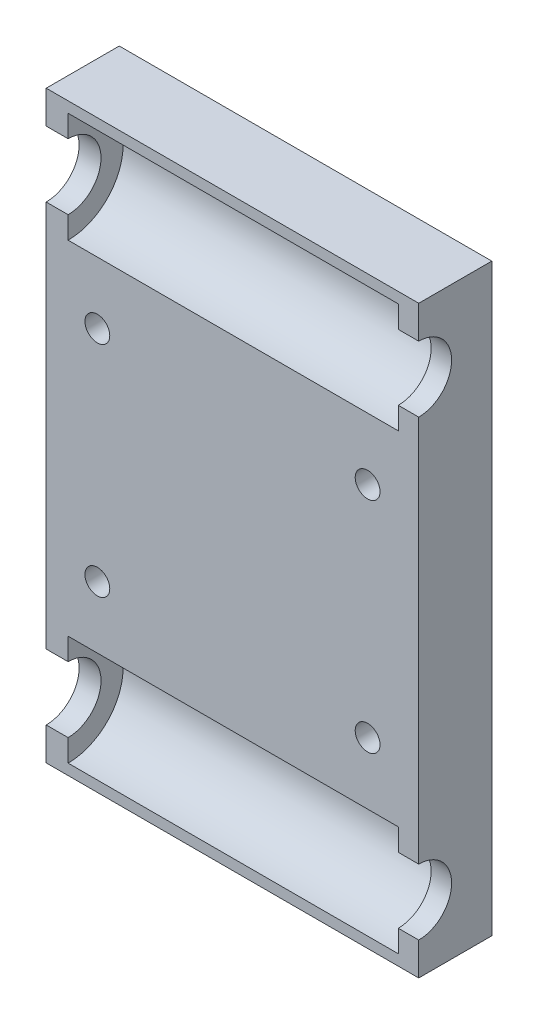
ISO-10303-21;
HEADER;
FILE_DESCRIPTION(('STEP AP214'),'2;1');
FILE_NAME('part.step','',(''),(''),'','','');
FILE_SCHEMA(('AUTOMOTIVE_DESIGN { 1 0 10303 214 1 1 1 1 }'));
ENDSEC;
DATA;
#1=APPLICATION_CONTEXT('core data for automotive mechanical design processes');
#2=APPLICATION_PROTOCOL_DEFINITION('international standard','automotive_design',2000,#1);
#3=PRODUCT_CONTEXT('',#1,'mechanical');
#4=PRODUCT('Part','Part','',(#3));
#5=PRODUCT_RELATED_PRODUCT_CATEGORY('part','',(#4));
#6=PRODUCT_DEFINITION_FORMATION('','',#4);
#7=PRODUCT_DEFINITION_CONTEXT('part definition',#1,'design');
#8=PRODUCT_DEFINITION('design','',#6,#7);
#9=PRODUCT_DEFINITION_SHAPE('','',#8);
#10=(LENGTH_UNIT() NAMED_UNIT(*) SI_UNIT(.MILLI.,.METRE.));
#11=(NAMED_UNIT(*) PLANE_ANGLE_UNIT() SI_UNIT($,.RADIAN.));
#12=(NAMED_UNIT(*) SI_UNIT($,.STERADIAN.) SOLID_ANGLE_UNIT());
#13=UNCERTAINTY_MEASURE_WITH_UNIT(LENGTH_MEASURE(1.E-05),#10,'distance_accuracy_value','');
#14=(GEOMETRIC_REPRESENTATION_CONTEXT(3) GLOBAL_UNCERTAINTY_ASSIGNED_CONTEXT((#13)) GLOBAL_UNIT_ASSIGNED_CONTEXT((#10,
#11,#12)) REPRESENTATION_CONTEXT('',''));
#15=CARTESIAN_POINT('',(0.,0.,0.));
#16=DIRECTION('',(0.,0.,1.));
#17=DIRECTION('',(1.,0.,0.));
#18=AXIS2_PLACEMENT_3D('',#15,#16,#17);
#19=CARTESIAN_POINT('',(7.,55.,10.));
#20=DIRECTION('',(0.,0.,-1.));
#21=DIRECTION('',(-1.,0.,0.));
#22=AXIS2_PLACEMENT_3D('',#19,#20,#21);
#23=CYLINDRICAL_SURFACE('',#22,1.7);
#24=CARTESIAN_POINT('',(7.,55.,10.));
#25=DIRECTION('',(0.,0.,1.));
#26=DIRECTION('',(1.,0.,0.));
#27=AXIS2_PLACEMENT_3D('',#24,#25,#26);
#28=CIRCLE('',#27,1.7);
#29=CARTESIAN_POINT('',(8.7,55.,10.));
#30=VERTEX_POINT('',#29);
#31=EDGE_CURVE('E197',#30,#30,#28,.T.);
#32=ORIENTED_EDGE('',*,*,#31,.T.);
#33=EDGE_LOOP('',(#32));
#34=FACE_BOUND('',#33,.T.);
#35=CARTESIAN_POINT('',(7.,55.,3.));
#36=DIRECTION('',(0.,0.,-1.));
#37=DIRECTION('',(-1.,0.,0.));
#38=AXIS2_PLACEMENT_3D('',#35,#36,#37);
#39=CIRCLE('',#38,1.7);
#40=CARTESIAN_POINT('',(5.3,55.,3.));
#41=VERTEX_POINT('',#40);
#42=EDGE_CURVE('E39',#41,#41,#39,.T.);
#43=ORIENTED_EDGE('',*,*,#42,.T.);
#44=EDGE_LOOP('',(#43));
#45=FACE_BOUND('',#44,.T.);
#46=ADVANCED_FACE('F35',(#34,#45),#23,.F.);
#47=CARTESIAN_POINT('',(44.,55.,10.));
#48=DIRECTION('',(0.,0.,-1.));
#49=DIRECTION('',(-1.,0.,0.));
#50=AXIS2_PLACEMENT_3D('',#47,#48,#49);
#51=CYLINDRICAL_SURFACE('',#50,1.7);
#52=CARTESIAN_POINT('',(44.,55.,10.));
#53=DIRECTION('',(0.,0.,1.));
#54=DIRECTION('',(1.,0.,0.));
#55=AXIS2_PLACEMENT_3D('',#52,#53,#54);
#56=CIRCLE('',#55,1.7);
#57=CARTESIAN_POINT('',(45.7,55.,10.));
#58=VERTEX_POINT('',#57);
#59=EDGE_CURVE('E290',#58,#58,#56,.T.);
#60=ORIENTED_EDGE('',*,*,#59,.T.);
#61=EDGE_LOOP('',(#60));
#62=FACE_BOUND('',#61,.T.);
#63=CARTESIAN_POINT('',(44.,55.,3.));
#64=DIRECTION('',(0.,0.,-1.));
#65=DIRECTION('',(-1.,0.,0.));
#66=AXIS2_PLACEMENT_3D('',#63,#64,#65);
#67=CIRCLE('',#66,1.7);
#68=CARTESIAN_POINT('',(42.3,55.,3.));
#69=VERTEX_POINT('',#68);
#70=EDGE_CURVE('E245',#69,#69,#67,.T.);
#71=ORIENTED_EDGE('',*,*,#70,.T.);
#72=EDGE_LOOP('',(#71));
#73=FACE_BOUND('',#72,.T.);
#74=ADVANCED_FACE('F393',(#62,#73),#51,.F.);
#75=CARTESIAN_POINT('',(7.,25.,10.));
#76=DIRECTION('',(0.,0.,-1.));
#77=DIRECTION('',(-1.,0.,0.));
#78=AXIS2_PLACEMENT_3D('',#75,#76,#77);
#79=CYLINDRICAL_SURFACE('',#78,1.7);
#80=CARTESIAN_POINT('',(7.,25.,10.));
#81=DIRECTION('',(0.,0.,1.));
#82=DIRECTION('',(1.,0.,0.));
#83=AXIS2_PLACEMENT_3D('',#80,#81,#82);
#84=CIRCLE('',#83,1.7);
#85=CARTESIAN_POINT('',(8.7,25.,10.));
#86=VERTEX_POINT('',#85);
#87=EDGE_CURVE('E287',#86,#86,#84,.T.);
#88=ORIENTED_EDGE('',*,*,#87,.T.);
#89=EDGE_LOOP('',(#88));
#90=FACE_BOUND('',#89,.T.);
#91=CARTESIAN_POINT('',(7.,25.,3.));
#92=DIRECTION('',(0.,0.,-1.));
#93=DIRECTION('',(-1.,0.,0.));
#94=AXIS2_PLACEMENT_3D('',#91,#92,#93);
#95=CIRCLE('',#94,1.7);
#96=CARTESIAN_POINT('',(5.3,25.,3.));
#97=VERTEX_POINT('',#96);
#98=EDGE_CURVE('E242',#97,#97,#95,.T.);
#99=ORIENTED_EDGE('',*,*,#98,.T.);
#100=EDGE_LOOP('',(#99));
#101=FACE_BOUND('',#100,.T.);
#102=ADVANCED_FACE('F399',(#90,#101),#79,.F.);
#103=CARTESIAN_POINT('',(44.,25.,10.));
#104=DIRECTION('',(0.,0.,-1.));
#105=DIRECTION('',(-1.,0.,0.));
#106=AXIS2_PLACEMENT_3D('',#103,#104,#105);
#107=CYLINDRICAL_SURFACE('',#106,1.7);
#108=CARTESIAN_POINT('',(44.,25.,10.));
#109=DIRECTION('',(0.,0.,1.));
#110=DIRECTION('',(1.,0.,0.));
#111=AXIS2_PLACEMENT_3D('',#108,#109,#110);
#112=CIRCLE('',#111,1.7);
#113=CARTESIAN_POINT('',(45.7,25.,10.));
#114=VERTEX_POINT('',#113);
#115=EDGE_CURVE('E275',#114,#114,#112,.T.);
#116=ORIENTED_EDGE('',*,*,#115,.T.);
#117=EDGE_LOOP('',(#116));
#118=FACE_BOUND('',#117,.T.);
#119=CARTESIAN_POINT('',(44.,25.,3.));
#120=DIRECTION('',(0.,0.,-1.));
#121=DIRECTION('',(-1.,0.,0.));
#122=AXIS2_PLACEMENT_3D('',#119,#120,#121);
#123=CIRCLE('',#122,1.7);
#124=CARTESIAN_POINT('',(42.3,25.,3.));
#125=VERTEX_POINT('',#124);
#126=EDGE_CURVE('E239',#125,#125,#123,.T.);
#127=ORIENTED_EDGE('',*,*,#126,.T.);
#128=EDGE_LOOP('',(#127));
#129=FACE_BOUND('',#128,.T.);
#130=ADVANCED_FACE('F439',(#118,#129),#107,.F.);
#131=CARTESIAN_POINT('',(0.,0.,10.));
#132=DIRECTION('',(0.,0.,-1.));
#133=DIRECTION('',(-1.,0.,0.));
#134=AXIS2_PLACEMENT_3D('',#131,#132,#133);
#135=PLANE('',#134);
#136=ORIENTED_EDGE('',*,*,#115,.F.);
#137=EDGE_LOOP('',(#136));
#138=FACE_BOUND('',#137,.T.);
#139=ORIENTED_EDGE('',*,*,#87,.F.);
#140=EDGE_LOOP('',(#139));
#141=FACE_BOUND('',#140,.T.);
#142=ORIENTED_EDGE('',*,*,#59,.F.);
#143=EDGE_LOOP('',(#142));
#144=FACE_BOUND('',#143,.T.);
#145=ORIENTED_EDGE('',*,*,#31,.F.);
#146=EDGE_LOOP('',(#145));
#147=FACE_BOUND('',#146,.T.);
#148=DIRECTION('',(0.,1.,0.));
#149=VECTOR('',#148,1.);
#150=CARTESIAN_POINT('',(51.,0.,10.));
#151=LINE('',#150,#149);
#152=CARTESIAN_POINT('',(51.,13.5,10.));
#153=VERTEX_POINT('',#152);
#154=CARTESIAN_POINT('',(51.,66.5,10.));
#155=VERTEX_POINT('',#154);
#156=EDGE_CURVE('E176',#153,#155,#151,.T.);
#157=ORIENTED_EDGE('',*,*,#156,.T.);
#158=DIRECTION('',(-1.,0.,0.));
#159=VECTOR('',#158,1.);
#160=CARTESIAN_POINT('',(51.,66.5,10.));
#161=LINE('',#160,#159);
#162=CARTESIAN_POINT('',(48.2,66.5,10.));
#163=VERTEX_POINT('',#162);
#164=EDGE_CURVE('E154',#155,#163,#161,.T.);
#165=ORIENTED_EDGE('',*,*,#164,.T.);
#166=DIRECTION('',(0.,1.,0.));
#167=VECTOR('',#166,1.);
#168=CARTESIAN_POINT('',(48.2,0.,10.));
#169=LINE('',#168,#167);
#170=CARTESIAN_POINT('',(48.2,63.475,10.));
#171=VERTEX_POINT('',#170);
#172=EDGE_CURVE('E234',#171,#163,#169,.T.);
#173=ORIENTED_EDGE('',*,*,#172,.F.);
#174=DIRECTION('',(-1.,0.,0.));
#175=VECTOR('',#174,1.);
#176=CARTESIAN_POINT('',(48.2,63.475,10.));
#177=LINE('',#176,#175);
#178=CARTESIAN_POINT('',(3.,63.475,10.));
#179=VERTEX_POINT('',#178);
#180=EDGE_CURVE('E231',#171,#179,#177,.T.);
#181=ORIENTED_EDGE('',*,*,#180,.T.);
#182=DIRECTION('',(0.,1.,0.));
#183=VECTOR('',#182,1.);
#184=CARTESIAN_POINT('',(3.,0.,10.));
#185=LINE('',#184,#183);
#186=CARTESIAN_POINT('',(3.,66.5,10.));
#187=VERTEX_POINT('',#186);
#188=EDGE_CURVE('E226',#179,#187,#185,.T.);
#189=ORIENTED_EDGE('',*,*,#188,.T.);
#190=CARTESIAN_POINT('',(0.,66.5,10.));
#191=VERTEX_POINT('',#190);
#192=EDGE_CURVE('E261',#187,#191,#161,.T.);
#193=ORIENTED_EDGE('',*,*,#192,.T.);
#194=DIRECTION('',(0.,-1.,0.));
#195=VECTOR('',#194,1.);
#196=CARTESIAN_POINT('',(0.,0.,10.));
#197=LINE('',#196,#195);
#198=CARTESIAN_POINT('',(0.,13.5,10.));
#199=VERTEX_POINT('',#198);
#200=EDGE_CURVE('E295',#191,#199,#197,.T.);
#201=ORIENTED_EDGE('',*,*,#200,.T.);
#202=DIRECTION('',(-1.,0.,0.));
#203=VECTOR('',#202,1.);
#204=CARTESIAN_POINT('',(51.,13.5,10.));
#205=LINE('',#204,#203);
#206=CARTESIAN_POINT('',(3.,13.5,10.));
#207=VERTEX_POINT('',#206);
#208=EDGE_CURVE('E265',#199,#207,#205,.F.);
#209=ORIENTED_EDGE('',*,*,#208,.T.);
#210=DIRECTION('',(0.,1.,0.));
#211=VECTOR('',#210,1.);
#212=CARTESIAN_POINT('',(3.,0.,10.));
#213=LINE('',#212,#211);
#214=CARTESIAN_POINT('',(3.,16.525,10.));
#215=VERTEX_POINT('',#214);
#216=EDGE_CURVE('E211',#207,#215,#213,.T.);
#217=ORIENTED_EDGE('',*,*,#216,.T.);
#218=DIRECTION('',(-1.,0.,0.));
#219=VECTOR('',#218,1.);
#220=CARTESIAN_POINT('',(48.2,16.525,10.));
#221=LINE('',#220,#219);
#222=CARTESIAN_POINT('',(48.2,16.525,10.));
#223=VERTEX_POINT('',#222);
#224=EDGE_CURVE('E215',#215,#223,#221,.F.);
#225=ORIENTED_EDGE('',*,*,#224,.T.);
#226=DIRECTION('',(0.,1.,0.));
#227=VECTOR('',#226,1.);
#228=CARTESIAN_POINT('',(48.2,0.,10.));
#229=LINE('',#228,#227);
#230=CARTESIAN_POINT('',(48.2,13.5,10.));
#231=VERTEX_POINT('',#230);
#232=EDGE_CURVE('E221',#231,#223,#229,.T.);
#233=ORIENTED_EDGE('',*,*,#232,.F.);
#234=EDGE_CURVE('E52',#231,#153,#205,.F.);
#235=ORIENTED_EDGE('',*,*,#234,.T.);
#236=EDGE_LOOP('',(#157,#165,#173,#181,#189,#193,#201,#209,#217,#225,#233,#235));
#237=FACE_BOUND('',#236,.T.);
#238=ADVANCED_FACE('F315',(#138,#141,#144,#147,#237),#135,.F.);
#239=CARTESIAN_POINT('',(51.,0.,10.));
#240=VERTEX_POINT('',#239);
#241=CARTESIAN_POINT('',(51.,4.49999999999999,10.));
#242=VERTEX_POINT('',#241);
#243=EDGE_CURVE('E179',#240,#242,#151,.T.);
#244=ORIENTED_EDGE('',*,*,#243,.T.);
#245=DIRECTION('',(-1.,0.,0.));
#246=VECTOR('',#245,1.);
#247=CARTESIAN_POINT('',(51.,4.49999999999999,10.));
#248=LINE('',#247,#246);
#249=CARTESIAN_POINT('',(48.2,4.49999999999999,10.));
#250=VERTEX_POINT('',#249);
#251=EDGE_CURVE('E270',#242,#250,#248,.T.);
#252=ORIENTED_EDGE('',*,*,#251,.T.);
#253=CARTESIAN_POINT('',(48.2,1.47499999999999,10.));
#254=VERTEX_POINT('',#253);
#255=EDGE_CURVE('E222',#254,#250,#229,.T.);
#256=ORIENTED_EDGE('',*,*,#255,.F.);
#257=DIRECTION('',(-1.,0.,0.));
#258=VECTOR('',#257,1.);
#259=CARTESIAN_POINT('',(48.2,1.47499999999999,10.));
#260=LINE('',#259,#258);
#261=CARTESIAN_POINT('',(3.,1.47499999999999,10.));
#262=VERTEX_POINT('',#261);
#263=EDGE_CURVE('E218',#254,#262,#260,.T.);
#264=ORIENTED_EDGE('',*,*,#263,.T.);
#265=CARTESIAN_POINT('',(3.,4.49999999999999,10.));
#266=VERTEX_POINT('',#265);
#267=EDGE_CURVE('E212',#262,#266,#213,.T.);
#268=ORIENTED_EDGE('',*,*,#267,.T.);
#269=CARTESIAN_POINT('',(0.,4.49999999999999,10.));
#270=VERTEX_POINT('',#269);
#271=EDGE_CURVE('E60',#266,#270,#248,.T.);
#272=ORIENTED_EDGE('',*,*,#271,.T.);
#273=CARTESIAN_POINT('',(0.,0.,10.));
#274=VERTEX_POINT('',#273);
#275=EDGE_CURVE('E202',#270,#274,#197,.T.);
#276=ORIENTED_EDGE('',*,*,#275,.T.);
#277=DIRECTION('',(1.,0.,0.));
#278=VECTOR('',#277,1.);
#279=CARTESIAN_POINT('',(0.,0.,10.));
#280=LINE('',#279,#278);
#281=EDGE_CURVE('E177',#274,#240,#280,.T.);
#282=ORIENTED_EDGE('',*,*,#281,.T.);
#283=EDGE_LOOP('',(#244,#252,#256,#264,#268,#272,#276,#282));
#284=FACE_BOUND('',#283,.T.);
#285=ADVANCED_FACE('F300',(#284),#135,.F.);
#286=CARTESIAN_POINT('',(0.,80.,10.));
#287=VERTEX_POINT('',#286);
#288=CARTESIAN_POINT('',(0.,75.5,10.));
#289=VERTEX_POINT('',#288);
#290=EDGE_CURVE('E180',#287,#289,#197,.T.);
#291=ORIENTED_EDGE('',*,*,#290,.T.);
#292=DIRECTION('',(-1.,0.,0.));
#293=VECTOR('',#292,1.);
#294=CARTESIAN_POINT('',(51.,75.5,10.));
#295=LINE('',#294,#293);
#296=CARTESIAN_POINT('',(3.,75.5,10.));
#297=VERTEX_POINT('',#296);
#298=EDGE_CURVE('E159',#289,#297,#295,.F.);
#299=ORIENTED_EDGE('',*,*,#298,.T.);
#300=CARTESIAN_POINT('',(3.,78.525,10.));
#301=VERTEX_POINT('',#300);
#302=EDGE_CURVE('E225',#297,#301,#185,.T.);
#303=ORIENTED_EDGE('',*,*,#302,.T.);
#304=DIRECTION('',(-1.,0.,0.));
#305=VECTOR('',#304,1.);
#306=CARTESIAN_POINT('',(48.2,78.525,10.));
#307=LINE('',#306,#305);
#308=CARTESIAN_POINT('',(48.2,78.525,10.));
#309=VERTEX_POINT('',#308);
#310=EDGE_CURVE('E229',#301,#309,#307,.F.);
#311=ORIENTED_EDGE('',*,*,#310,.T.);
#312=CARTESIAN_POINT('',(48.2,75.5,10.));
#313=VERTEX_POINT('',#312);
#314=EDGE_CURVE('E169',#313,#309,#169,.T.);
#315=ORIENTED_EDGE('',*,*,#314,.F.);
#316=CARTESIAN_POINT('',(51.,75.5,10.));
#317=VERTEX_POINT('',#316);
#318=EDGE_CURVE('E151',#313,#317,#295,.F.);
#319=ORIENTED_EDGE('',*,*,#318,.T.);
#320=CARTESIAN_POINT('',(51.,80.,10.));
#321=VERTEX_POINT('',#320);
#322=EDGE_CURVE('E166',#317,#321,#151,.T.);
#323=ORIENTED_EDGE('',*,*,#322,.T.);
#324=DIRECTION('',(-1.,0.,0.));
#325=VECTOR('',#324,1.);
#326=CARTESIAN_POINT('',(0.,80.,10.));
#327=LINE('',#326,#325);
#328=EDGE_CURVE('E184',#321,#287,#327,.T.);
#329=ORIENTED_EDGE('',*,*,#328,.T.);
#330=EDGE_LOOP('',(#291,#299,#303,#311,#315,#319,#323,#329));
#331=FACE_BOUND('',#330,.T.);
#332=ADVANCED_FACE('F165',(#331),#135,.F.);
#333=CARTESIAN_POINT('',(0.,0.,0.));
#334=DIRECTION('',(0.,0.,-1.));
#335=DIRECTION('',(-1.,0.,0.));
#336=AXIS2_PLACEMENT_3D('',#333,#334,#335);
#337=PLANE('',#336);
#338=CARTESIAN_POINT('',(44.,25.,0.));
#339=DIRECTION('',(0.,0.,-1.));
#340=DIRECTION('',(-1.,0.,0.));
#341=AXIS2_PLACEMENT_3D('',#338,#339,#340);
#342=CIRCLE('',#341,3.);
#343=CARTESIAN_POINT('',(41.,25.,0.));
#344=VERTEX_POINT('',#343);
#345=EDGE_CURVE('E343',#344,#344,#342,.T.);
#346=ORIENTED_EDGE('',*,*,#345,.F.);
#347=EDGE_LOOP('',(#346));
#348=FACE_BOUND('',#347,.T.);
#349=CARTESIAN_POINT('',(7.,25.,0.));
#350=DIRECTION('',(0.,0.,-1.));
#351=DIRECTION('',(-1.,0.,0.));
#352=AXIS2_PLACEMENT_3D('',#349,#350,#351);
#353=CIRCLE('',#352,3.);
#354=CARTESIAN_POINT('',(4.,25.,0.));
#355=VERTEX_POINT('',#354);
#356=EDGE_CURVE('E349',#355,#355,#353,.T.);
#357=ORIENTED_EDGE('',*,*,#356,.F.);
#358=EDGE_LOOP('',(#357));
#359=FACE_BOUND('',#358,.T.);
#360=CARTESIAN_POINT('',(7.,55.,0.));
#361=DIRECTION('',(0.,0.,-1.));
#362=DIRECTION('',(-1.,0.,0.));
#363=AXIS2_PLACEMENT_3D('',#360,#361,#362);
#364=CIRCLE('',#363,3.);
#365=CARTESIAN_POINT('',(4.,55.,0.));
#366=VERTEX_POINT('',#365);
#367=EDGE_CURVE('E355',#366,#366,#364,.T.);
#368=ORIENTED_EDGE('',*,*,#367,.F.);
#369=EDGE_LOOP('',(#368));
#370=FACE_BOUND('',#369,.T.);
#371=CARTESIAN_POINT('',(44.,55.,0.));
#372=DIRECTION('',(0.,0.,-1.));
#373=DIRECTION('',(-1.,0.,0.));
#374=AXIS2_PLACEMENT_3D('',#371,#372,#373);
#375=CIRCLE('',#374,3.);
#376=CARTESIAN_POINT('',(41.,55.,0.));
#377=VERTEX_POINT('',#376);
#378=EDGE_CURVE('E337',#377,#377,#375,.T.);
#379=ORIENTED_EDGE('',*,*,#378,.F.);
#380=EDGE_LOOP('',(#379));
#381=FACE_BOUND('',#380,.T.);
#382=DIRECTION('',(0.,-1.,0.));
#383=VECTOR('',#382,1.);
#384=CARTESIAN_POINT('',(0.,0.,0.));
#385=LINE('',#384,#383);
#386=CARTESIAN_POINT('',(0.,80.,0.));
#387=VERTEX_POINT('',#386);
#388=CARTESIAN_POINT('',(0.,0.,0.));
#389=VERTEX_POINT('',#388);
#390=EDGE_CURVE('E193',#387,#389,#385,.T.);
#391=ORIENTED_EDGE('',*,*,#390,.F.);
#392=DIRECTION('',(-1.,0.,0.));
#393=VECTOR('',#392,1.);
#394=CARTESIAN_POINT('',(0.,80.,0.));
#395=LINE('',#394,#393);
#396=CARTESIAN_POINT('',(51.,80.,0.));
#397=VERTEX_POINT('',#396);
#398=EDGE_CURVE('E201',#397,#387,#395,.T.);
#399=ORIENTED_EDGE('',*,*,#398,.F.);
#400=DIRECTION('',(0.,1.,0.));
#401=VECTOR('',#400,1.);
#402=CARTESIAN_POINT('',(51.,0.,0.));
#403=LINE('',#402,#401);
#404=CARTESIAN_POINT('',(51.,0.,0.));
#405=VERTEX_POINT('',#404);
#406=EDGE_CURVE('E199',#405,#397,#403,.T.);
#407=ORIENTED_EDGE('',*,*,#406,.F.);
#408=DIRECTION('',(1.,0.,0.));
#409=VECTOR('',#408,1.);
#410=CARTESIAN_POINT('',(0.,0.,0.));
#411=LINE('',#410,#409);
#412=EDGE_CURVE('E196',#389,#405,#411,.T.);
#413=ORIENTED_EDGE('',*,*,#412,.F.);
#414=EDGE_LOOP('',(#391,#399,#407,#413));
#415=FACE_BOUND('',#414,.T.);
#416=ADVANCED_FACE('F310',(#348,#359,#370,#381,#415),#337,.T.);
#417=CARTESIAN_POINT('',(0.,0.,10.));
#418=DIRECTION('',(1.,0.,0.));
#419=DIRECTION('',(0.,0.,-1.));
#420=AXIS2_PLACEMENT_3D('',#417,#418,#419);
#421=PLANE('',#420);
#422=ORIENTED_EDGE('',*,*,#200,.F.);
#423=CARTESIAN_POINT('',(0.,71.,10.));
#424=DIRECTION('',(-1.,0.,0.));
#425=DIRECTION('',(0.,0.,1.));
#426=AXIS2_PLACEMENT_3D('',#423,#424,#425);
#427=CIRCLE('',#426,4.5);
#428=EDGE_CURVE('E160',#289,#191,#427,.T.);
#429=ORIENTED_EDGE('',*,*,#428,.F.);
#430=ORIENTED_EDGE('',*,*,#290,.F.);
#431=DIRECTION('',(0.,0.,-1.));
#432=VECTOR('',#431,1.);
#433=CARTESIAN_POINT('',(0.,80.,10.));
#434=LINE('',#433,#432);
#435=EDGE_CURVE('E188',#287,#387,#434,.T.);
#436=ORIENTED_EDGE('',*,*,#435,.T.);
#437=ORIENTED_EDGE('',*,*,#390,.T.);
#438=DIRECTION('',(0.,0.,-1.));
#439=VECTOR('',#438,1.);
#440=CARTESIAN_POINT('',(0.,0.,10.));
#441=LINE('',#440,#439);
#442=EDGE_CURVE('E208',#274,#389,#441,.T.);
#443=ORIENTED_EDGE('',*,*,#442,.F.);
#444=ORIENTED_EDGE('',*,*,#275,.F.);
#445=CARTESIAN_POINT('',(0.,8.99999999999999,10.));
#446=DIRECTION('',(-1.,0.,0.));
#447=DIRECTION('',(0.,0.,1.));
#448=AXIS2_PLACEMENT_3D('',#445,#446,#447);
#449=CIRCLE('',#448,4.5);
#450=EDGE_CURVE('E250',#199,#270,#449,.T.);
#451=ORIENTED_EDGE('',*,*,#450,.F.);
#452=EDGE_LOOP('',(#422,#429,#430,#436,#437,#443,#444,#451));
#453=FACE_BOUND('',#452,.T.);
#454=ADVANCED_FACE('F37',(#453),#421,.F.);
#455=CARTESIAN_POINT('',(0.,0.,10.));
#456=DIRECTION('',(0.,1.,0.));
#457=DIRECTION('',(0.,0.,1.));
#458=AXIS2_PLACEMENT_3D('',#455,#456,#457);
#459=PLANE('',#458);
#460=ORIENTED_EDGE('',*,*,#412,.T.);
#461=DIRECTION('',(0.,0.,-1.));
#462=VECTOR('',#461,1.);
#463=CARTESIAN_POINT('',(51.,0.,10.));
#464=LINE('',#463,#462);
#465=EDGE_CURVE('E205',#240,#405,#464,.T.);
#466=ORIENTED_EDGE('',*,*,#465,.F.);
#467=ORIENTED_EDGE('',*,*,#281,.F.);
#468=ORIENTED_EDGE('',*,*,#442,.T.);
#469=EDGE_LOOP('',(#460,#466,#467,#468));
#470=FACE_BOUND('',#469,.T.);
#471=ADVANCED_FACE('F305',(#470),#459,.F.);
#472=CARTESIAN_POINT('',(51.,0.,10.));
#473=DIRECTION('',(-1.,0.,0.));
#474=DIRECTION('',(0.,0.,1.));
#475=AXIS2_PLACEMENT_3D('',#472,#473,#474);
#476=PLANE('',#475);
#477=ORIENTED_EDGE('',*,*,#322,.F.);
#478=CARTESIAN_POINT('',(51.,71.,10.));
#479=DIRECTION('',(-1.,0.,0.));
#480=DIRECTION('',(0.,0.,1.));
#481=AXIS2_PLACEMENT_3D('',#478,#479,#480);
#482=CIRCLE('',#481,4.5);
#483=EDGE_CURVE('E148',#317,#155,#482,.T.);
#484=ORIENTED_EDGE('',*,*,#483,.T.);
#485=ORIENTED_EDGE('',*,*,#156,.F.);
#486=CARTESIAN_POINT('',(51.,8.99999999999999,10.));
#487=DIRECTION('',(-1.,0.,0.));
#488=DIRECTION('',(0.,0.,1.));
#489=AXIS2_PLACEMENT_3D('',#486,#487,#488);
#490=CIRCLE('',#489,4.5);
#491=EDGE_CURVE('E253',#153,#242,#490,.T.);
#492=ORIENTED_EDGE('',*,*,#491,.T.);
#493=ORIENTED_EDGE('',*,*,#243,.F.);
#494=ORIENTED_EDGE('',*,*,#465,.T.);
#495=ORIENTED_EDGE('',*,*,#406,.T.);
#496=DIRECTION('',(0.,0.,-1.));
#497=VECTOR('',#496,1.);
#498=CARTESIAN_POINT('',(51.,80.,10.));
#499=LINE('',#498,#497);
#500=EDGE_CURVE('E174',#321,#397,#499,.T.);
#501=ORIENTED_EDGE('',*,*,#500,.F.);
#502=EDGE_LOOP('',(#477,#484,#485,#492,#493,#494,#495,#501));
#503=FACE_BOUND('',#502,.T.);
#504=ADVANCED_FACE('F172',(#503),#476,.F.);
#505=CARTESIAN_POINT('',(0.,80.,10.));
#506=DIRECTION('',(0.,-1.,0.));
#507=DIRECTION('',(0.,0.,-1.));
#508=AXIS2_PLACEMENT_3D('',#505,#506,#507);
#509=PLANE('',#508);
#510=ORIENTED_EDGE('',*,*,#398,.T.);
#511=ORIENTED_EDGE('',*,*,#435,.F.);
#512=ORIENTED_EDGE('',*,*,#328,.F.);
#513=ORIENTED_EDGE('',*,*,#500,.T.);
#514=EDGE_LOOP('',(#510,#511,#512,#513));
#515=FACE_BOUND('',#514,.T.);
#516=ADVANCED_FACE('F406',(#515),#509,.F.);
#517=CARTESIAN_POINT('',(48.2,8.99999999999999,10.));
#518=DIRECTION('',(-1.,0.,0.));
#519=DIRECTION('',(0.,0.,1.));
#520=AXIS2_PLACEMENT_3D('',#517,#518,#519);
#521=CYLINDRICAL_SURFACE('',#520,7.525);
#522=CARTESIAN_POINT('',(48.2,8.99999999999999,10.));
#523=DIRECTION('',(-1.,0.,0.));
#524=DIRECTION('',(0.,0.,1.));
#525=AXIS2_PLACEMENT_3D('',#522,#523,#524);
#526=CIRCLE('',#525,7.525);
#527=EDGE_CURVE('E279',#223,#254,#526,.T.);
#528=ORIENTED_EDGE('',*,*,#527,.F.);
#529=ORIENTED_EDGE('',*,*,#224,.F.);
#530=CARTESIAN_POINT('',(3.,8.99999999999999,10.));
#531=DIRECTION('',(-1.,0.,0.));
#532=DIRECTION('',(0.,0.,1.));
#533=AXIS2_PLACEMENT_3D('',#530,#531,#532);
#534=CIRCLE('',#533,7.525);
#535=EDGE_CURVE('E282',#215,#262,#534,.T.);
#536=ORIENTED_EDGE('',*,*,#535,.T.);
#537=ORIENTED_EDGE('',*,*,#263,.F.);
#538=EDGE_LOOP('',(#528,#529,#536,#537));
#539=FACE_BOUND('',#538,.T.);
#540=ADVANCED_FACE('F322',(#539),#521,.F.);
#541=CARTESIAN_POINT('',(48.2,8.99999999999999,10.));
#542=DIRECTION('',(-1.,0.,0.));
#543=DIRECTION('',(0.,0.,1.));
#544=AXIS2_PLACEMENT_3D('',#541,#542,#543);
#545=PLANE('',#544);
#546=CARTESIAN_POINT('',(48.2,8.99999999999999,10.));
#547=DIRECTION('',(-1.,0.,0.));
#548=DIRECTION('',(0.,0.,1.));
#549=AXIS2_PLACEMENT_3D('',#546,#547,#548);
#550=CIRCLE('',#549,4.5);
#551=EDGE_CURVE('E269',#231,#250,#550,.T.);
#552=ORIENTED_EDGE('',*,*,#551,.F.);
#553=ORIENTED_EDGE('',*,*,#232,.T.);
#554=ORIENTED_EDGE('',*,*,#527,.T.);
#555=ORIENTED_EDGE('',*,*,#255,.T.);
#556=EDGE_LOOP('',(#552,#553,#554,#555));
#557=FACE_BOUND('',#556,.T.);
#558=ADVANCED_FACE('F318',(#557),#545,.T.);
#559=CARTESIAN_POINT('',(3.,8.99999999999999,10.));
#560=DIRECTION('',(-1.,0.,0.));
#561=DIRECTION('',(0.,0.,1.));
#562=AXIS2_PLACEMENT_3D('',#559,#560,#561);
#563=PLANE('',#562);
#564=ORIENTED_EDGE('',*,*,#216,.F.);
#565=CARTESIAN_POINT('',(3.,8.99999999999999,10.));
#566=DIRECTION('',(-1.,0.,0.));
#567=DIRECTION('',(0.,0.,1.));
#568=AXIS2_PLACEMENT_3D('',#565,#566,#567);
#569=CIRCLE('',#568,4.5);
#570=EDGE_CURVE('E11',#207,#266,#569,.T.);
#571=ORIENTED_EDGE('',*,*,#570,.T.);
#572=ORIENTED_EDGE('',*,*,#267,.F.);
#573=ORIENTED_EDGE('',*,*,#535,.F.);
#574=EDGE_LOOP('',(#564,#571,#572,#573));
#575=FACE_BOUND('',#574,.T.);
#576=ADVANCED_FACE('F326',(#575),#563,.F.);
#577=CARTESIAN_POINT('',(48.2,71.,10.));
#578=DIRECTION('',(-1.,0.,0.));
#579=DIRECTION('',(0.,0.,1.));
#580=AXIS2_PLACEMENT_3D('',#577,#578,#579);
#581=CYLINDRICAL_SURFACE('',#580,7.525);
#582=CARTESIAN_POINT('',(48.2,71.,10.));
#583=DIRECTION('',(-1.,0.,0.));
#584=DIRECTION('',(0.,0.,1.));
#585=AXIS2_PLACEMENT_3D('',#582,#583,#584);
#586=CIRCLE('',#585,7.525);
#587=EDGE_CURVE('E272',#309,#171,#586,.T.);
#588=ORIENTED_EDGE('',*,*,#587,.F.);
#589=ORIENTED_EDGE('',*,*,#310,.F.);
#590=CARTESIAN_POINT('',(3.,71.,10.));
#591=DIRECTION('',(-1.,0.,0.));
#592=DIRECTION('',(0.,0.,1.));
#593=AXIS2_PLACEMENT_3D('',#590,#591,#592);
#594=CIRCLE('',#593,7.525);
#595=EDGE_CURVE('E276',#301,#179,#594,.T.);
#596=ORIENTED_EDGE('',*,*,#595,.T.);
#597=ORIENTED_EDGE('',*,*,#180,.F.);
#598=EDGE_LOOP('',(#588,#589,#596,#597));
#599=FACE_BOUND('',#598,.T.);
#600=ADVANCED_FACE('F511',(#599),#581,.F.);
#601=CARTESIAN_POINT('',(48.2,71.,10.));
#602=DIRECTION('',(-1.,0.,0.));
#603=DIRECTION('',(0.,0.,1.));
#604=AXIS2_PLACEMENT_3D('',#601,#602,#603);
#605=PLANE('',#604);
#606=CARTESIAN_POINT('',(48.2,71.,10.));
#607=DIRECTION('',(-1.,0.,0.));
#608=DIRECTION('',(0.,0.,1.));
#609=AXIS2_PLACEMENT_3D('',#606,#607,#608);
#610=CIRCLE('',#609,4.5);
#611=EDGE_CURVE('E170',#313,#163,#610,.T.);
#612=ORIENTED_EDGE('',*,*,#611,.F.);
#613=ORIENTED_EDGE('',*,*,#314,.T.);
#614=ORIENTED_EDGE('',*,*,#587,.T.);
#615=ORIENTED_EDGE('',*,*,#172,.T.);
#616=EDGE_LOOP('',(#612,#613,#614,#615));
#617=FACE_BOUND('',#616,.T.);
#618=ADVANCED_FACE('F502',(#617),#605,.T.);
#619=CARTESIAN_POINT('',(3.,71.,10.));
#620=DIRECTION('',(-1.,0.,0.));
#621=DIRECTION('',(0.,0.,1.));
#622=AXIS2_PLACEMENT_3D('',#619,#620,#621);
#623=PLANE('',#622);
#624=ORIENTED_EDGE('',*,*,#302,.F.);
#625=CARTESIAN_POINT('',(3.,71.,10.));
#626=DIRECTION('',(-1.,0.,0.));
#627=DIRECTION('',(0.,0.,1.));
#628=AXIS2_PLACEMENT_3D('',#625,#626,#627);
#629=CIRCLE('',#628,4.5);
#630=EDGE_CURVE('E44',#297,#187,#629,.T.);
#631=ORIENTED_EDGE('',*,*,#630,.T.);
#632=ORIENTED_EDGE('',*,*,#188,.F.);
#633=ORIENTED_EDGE('',*,*,#595,.F.);
#634=EDGE_LOOP('',(#624,#631,#632,#633));
#635=FACE_BOUND('',#634,.T.);
#636=ADVANCED_FACE('F333',(#635),#623,.F.);
#637=CARTESIAN_POINT('',(51.,71.,10.));
#638=DIRECTION('',(-1.,0.,0.));
#639=DIRECTION('',(0.,0.,1.));
#640=AXIS2_PLACEMENT_3D('',#637,#638,#639);
#641=CYLINDRICAL_SURFACE('',#640,4.5);
#642=ORIENTED_EDGE('',*,*,#630,.F.);
#643=ORIENTED_EDGE('',*,*,#298,.F.);
#644=ORIENTED_EDGE('',*,*,#428,.T.);
#645=ORIENTED_EDGE('',*,*,#192,.F.);
#646=EDGE_LOOP('',(#642,#643,#644,#645));
#647=FACE_BOUND('',#646,.T.);
#648=ADVANCED_FACE('F330',(#647),#641,.F.);
#649=ORIENTED_EDGE('',*,*,#483,.F.);
#650=ORIENTED_EDGE('',*,*,#318,.F.);
#651=ORIENTED_EDGE('',*,*,#611,.T.);
#652=ORIENTED_EDGE('',*,*,#164,.F.);
#653=EDGE_LOOP('',(#649,#650,#651,#652));
#654=FACE_BOUND('',#653,.T.);
#655=ADVANCED_FACE('F150',(#654),#641,.F.);
#656=CARTESIAN_POINT('',(51.,8.99999999999999,10.));
#657=DIRECTION('',(-1.,0.,0.));
#658=DIRECTION('',(0.,0.,1.));
#659=AXIS2_PLACEMENT_3D('',#656,#657,#658);
#660=CYLINDRICAL_SURFACE('',#659,4.5);
#661=ORIENTED_EDGE('',*,*,#570,.F.);
#662=ORIENTED_EDGE('',*,*,#208,.F.);
#663=ORIENTED_EDGE('',*,*,#450,.T.);
#664=ORIENTED_EDGE('',*,*,#271,.F.);
#665=EDGE_LOOP('',(#661,#662,#663,#664));
#666=FACE_BOUND('',#665,.T.);
#667=ADVANCED_FACE('F327',(#666),#660,.F.);
#668=ORIENTED_EDGE('',*,*,#491,.F.);
#669=ORIENTED_EDGE('',*,*,#234,.F.);
#670=ORIENTED_EDGE('',*,*,#551,.T.);
#671=ORIENTED_EDGE('',*,*,#251,.F.);
#672=EDGE_LOOP('',(#668,#669,#670,#671));
#673=FACE_BOUND('',#672,.T.);
#674=ADVANCED_FACE('F312',(#673),#660,.F.);
#675=CARTESIAN_POINT('',(44.,25.,3.));
#676=DIRECTION('',(0.,0.,-1.));
#677=DIRECTION('',(-1.,0.,0.));
#678=AXIS2_PLACEMENT_3D('',#675,#676,#677);
#679=CYLINDRICAL_SURFACE('',#678,3.);
#680=CARTESIAN_POINT('',(44.,25.,3.));
#681=DIRECTION('',(0.,0.,-1.));
#682=DIRECTION('',(-1.,0.,0.));
#683=AXIS2_PLACEMENT_3D('',#680,#681,#682);
#684=CIRCLE('',#683,3.);
#685=CARTESIAN_POINT('',(41.,25.,3.));
#686=VERTEX_POINT('',#685);
#687=EDGE_CURVE('E346',#686,#686,#684,.T.);
#688=ORIENTED_EDGE('',*,*,#687,.F.);
#689=EDGE_LOOP('',(#688));
#690=FACE_BOUND('',#689,.T.);
#691=ORIENTED_EDGE('',*,*,#345,.T.);
#692=EDGE_LOOP('',(#691));
#693=FACE_BOUND('',#692,.T.);
#694=ADVANCED_FACE('F471',(#690,#693),#679,.F.);
#695=CARTESIAN_POINT('',(44.,25.,3.));
#696=DIRECTION('',(0.,0.,-1.));
#697=DIRECTION('',(-1.,0.,0.));
#698=AXIS2_PLACEMENT_3D('',#695,#696,#697);
#699=PLANE('',#698);
#700=ORIENTED_EDGE('',*,*,#126,.F.);
#701=EDGE_LOOP('',(#700));
#702=FACE_BOUND('',#701,.T.);
#703=ORIENTED_EDGE('',*,*,#687,.T.);
#704=EDGE_LOOP('',(#703));
#705=FACE_BOUND('',#704,.T.);
#706=ADVANCED_FACE('F577',(#702,#705),#699,.T.);
#707=CARTESIAN_POINT('',(7.,25.,3.));
#708=DIRECTION('',(0.,0.,-1.));
#709=DIRECTION('',(-1.,0.,0.));
#710=AXIS2_PLACEMENT_3D('',#707,#708,#709);
#711=CYLINDRICAL_SURFACE('',#710,3.);
#712=CARTESIAN_POINT('',(7.,25.,3.));
#713=DIRECTION('',(0.,0.,-1.));
#714=DIRECTION('',(-1.,0.,0.));
#715=AXIS2_PLACEMENT_3D('',#712,#713,#714);
#716=CIRCLE('',#715,3.);
#717=CARTESIAN_POINT('',(4.,25.,3.));
#718=VERTEX_POINT('',#717);
#719=EDGE_CURVE('E352',#718,#718,#716,.T.);
#720=ORIENTED_EDGE('',*,*,#719,.F.);
#721=EDGE_LOOP('',(#720));
#722=FACE_BOUND('',#721,.T.);
#723=ORIENTED_EDGE('',*,*,#356,.T.);
#724=EDGE_LOOP('',(#723));
#725=FACE_BOUND('',#724,.T.);
#726=ADVANCED_FACE('F387',(#722,#725),#711,.F.);
#727=CARTESIAN_POINT('',(7.,25.,3.));
#728=DIRECTION('',(0.,0.,-1.));
#729=DIRECTION('',(-1.,0.,0.));
#730=AXIS2_PLACEMENT_3D('',#727,#728,#729);
#731=PLANE('',#730);
#732=ORIENTED_EDGE('',*,*,#98,.F.);
#733=EDGE_LOOP('',(#732));
#734=FACE_BOUND('',#733,.T.);
#735=ORIENTED_EDGE('',*,*,#719,.T.);
#736=EDGE_LOOP('',(#735));
#737=FACE_BOUND('',#736,.T.);
#738=ADVANCED_FACE('F378',(#734,#737),#731,.T.);
#739=CARTESIAN_POINT('',(44.,55.,3.));
#740=DIRECTION('',(0.,0.,-1.));
#741=DIRECTION('',(-1.,0.,0.));
#742=AXIS2_PLACEMENT_3D('',#739,#740,#741);
#743=CYLINDRICAL_SURFACE('',#742,3.);
#744=CARTESIAN_POINT('',(44.,55.,3.));
#745=DIRECTION('',(0.,0.,-1.));
#746=DIRECTION('',(-1.,0.,0.));
#747=AXIS2_PLACEMENT_3D('',#744,#745,#746);
#748=CIRCLE('',#747,3.);
#749=CARTESIAN_POINT('',(41.,55.,3.));
#750=VERTEX_POINT('',#749);
#751=EDGE_CURVE('E243',#750,#750,#748,.T.);
#752=ORIENTED_EDGE('',*,*,#751,.F.);
#753=EDGE_LOOP('',(#752));
#754=FACE_BOUND('',#753,.T.);
#755=ORIENTED_EDGE('',*,*,#378,.T.);
#756=EDGE_LOOP('',(#755));
#757=FACE_BOUND('',#756,.T.);
#758=ADVANCED_FACE('F376',(#754,#757),#743,.F.);
#759=CARTESIAN_POINT('',(44.,55.,3.));
#760=DIRECTION('',(0.,0.,-1.));
#761=DIRECTION('',(-1.,0.,0.));
#762=AXIS2_PLACEMENT_3D('',#759,#760,#761);
#763=PLANE('',#762);
#764=ORIENTED_EDGE('',*,*,#70,.F.);
#765=EDGE_LOOP('',(#764));
#766=FACE_BOUND('',#765,.T.);
#767=ORIENTED_EDGE('',*,*,#751,.T.);
#768=EDGE_LOOP('',(#767));
#769=FACE_BOUND('',#768,.T.);
#770=ADVANCED_FACE('F366',(#766,#769),#763,.T.);
#771=CARTESIAN_POINT('',(7.,55.,3.));
#772=DIRECTION('',(0.,0.,-1.));
#773=DIRECTION('',(-1.,0.,0.));
#774=AXIS2_PLACEMENT_3D('',#771,#772,#773);
#775=CYLINDRICAL_SURFACE('',#774,3.);
#776=CARTESIAN_POINT('',(7.,55.,3.));
#777=DIRECTION('',(0.,0.,-1.));
#778=DIRECTION('',(-1.,0.,0.));
#779=AXIS2_PLACEMENT_3D('',#776,#777,#778);
#780=CIRCLE('',#779,3.);
#781=CARTESIAN_POINT('',(4.,55.,3.));
#782=VERTEX_POINT('',#781);
#783=EDGE_CURVE('E340',#782,#782,#780,.T.);
#784=ORIENTED_EDGE('',*,*,#783,.F.);
#785=EDGE_LOOP('',(#784));
#786=FACE_BOUND('',#785,.T.);
#787=ORIENTED_EDGE('',*,*,#367,.T.);
#788=EDGE_LOOP('',(#787));
#789=FACE_BOUND('',#788,.T.);
#790=ADVANCED_FACE('F363',(#786,#789),#775,.F.);
#791=CARTESIAN_POINT('',(7.,55.,3.));
#792=DIRECTION('',(0.,0.,-1.));
#793=DIRECTION('',(-1.,0.,0.));
#794=AXIS2_PLACEMENT_3D('',#791,#792,#793);
#795=PLANE('',#794);
#796=ORIENTED_EDGE('',*,*,#42,.F.);
#797=EDGE_LOOP('',(#796));
#798=FACE_BOUND('',#797,.T.);
#799=ORIENTED_EDGE('',*,*,#783,.T.);
#800=EDGE_LOOP('',(#799));
#801=FACE_BOUND('',#800,.T.);
#802=ADVANCED_FACE('F361',(#798,#801),#795,.T.);
#803=CLOSED_SHELL('',(#46,#74,#102,#130,#238,#285,#332,#416,#454,#471,#504,#516,#540,#558,#576,
#600,#618,#636,#648,#655,#667,#674,#694,#706,#726,#738,#758,#770,#790,#802));
#804=MANIFOLD_SOLID_BREP('B2',#803);
#805=ADVANCED_BREP_SHAPE_REPRESENTATION('',(#18,#804),#14);
#806=SHAPE_DEFINITION_REPRESENTATION(#9,#805);
ENDSEC;
END-ISO-10303-21;
